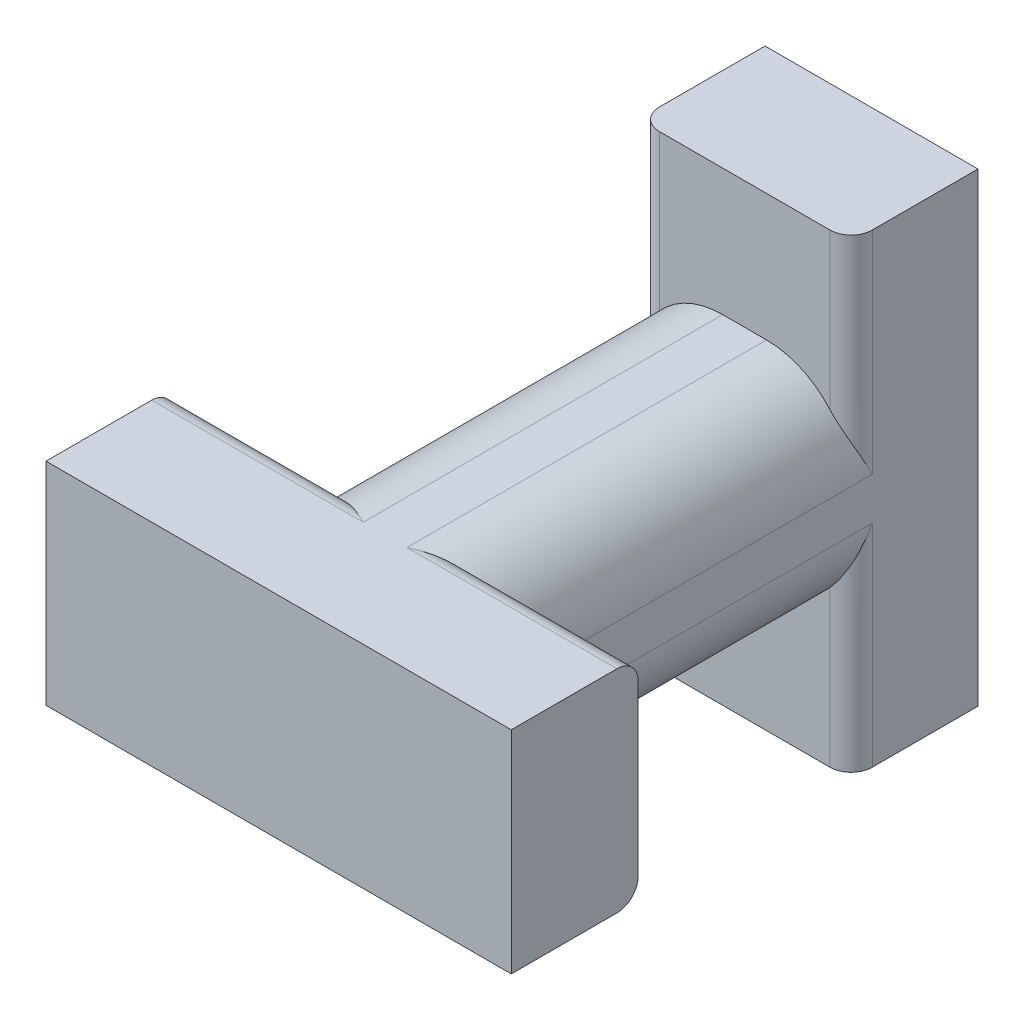
ISO-10303-21;
HEADER;
FILE_DESCRIPTION(('STEP AP214'),'2;1');
FILE_NAME('part.step','',(''),(''),'','','');
FILE_SCHEMA(('AUTOMOTIVE_DESIGN { 1 0 10303 214 1 1 1 1 }'));
ENDSEC;
DATA;
#1=APPLICATION_CONTEXT('core data for automotive mechanical design processes');
#2=APPLICATION_PROTOCOL_DEFINITION('international standard','automotive_design',2000,#1);
#3=PRODUCT_CONTEXT('',#1,'mechanical');
#4=PRODUCT('Part','Part','',(#3));
#5=PRODUCT_RELATED_PRODUCT_CATEGORY('part','',(#4));
#6=PRODUCT_DEFINITION_FORMATION('','',#4);
#7=PRODUCT_DEFINITION_CONTEXT('part definition',#1,'design');
#8=PRODUCT_DEFINITION('design','',#6,#7);
#9=PRODUCT_DEFINITION_SHAPE('','',#8);
#10=(LENGTH_UNIT() NAMED_UNIT(*) SI_UNIT(.MILLI.,.METRE.));
#11=(NAMED_UNIT(*) PLANE_ANGLE_UNIT() SI_UNIT($,.RADIAN.));
#12=(NAMED_UNIT(*) SI_UNIT($,.STERADIAN.) SOLID_ANGLE_UNIT());
#13=UNCERTAINTY_MEASURE_WITH_UNIT(LENGTH_MEASURE(1.E-05),#10,'distance_accuracy_value','');
#14=(GEOMETRIC_REPRESENTATION_CONTEXT(3) GLOBAL_UNCERTAINTY_ASSIGNED_CONTEXT((#13)) GLOBAL_UNIT_ASSIGNED_CONTEXT((#10,
#11,#12)) REPRESENTATION_CONTEXT('',''));
#15=CARTESIAN_POINT('',(0.,0.,0.));
#16=DIRECTION('',(0.,0.,1.));
#17=DIRECTION('',(1.,0.,0.));
#18=AXIS2_PLACEMENT_3D('',#15,#16,#17);
#19=CARTESIAN_POINT('',(36.8133356797978,21.4816414703038,8.));
#20=DIRECTION('',(-1.,0.,0.));
#21=DIRECTION('',(0.,0.,1.));
#22=AXIS2_PLACEMENT_3D('',#19,#20,#21);
#23=PLANE('',#22);
#24=DIRECTION('',(0.,0.,-1.));
#25=VECTOR('',#24,1.);
#26=CARTESIAN_POINT('',(36.8133356797978,18.4816414703039,8.));
#27=LINE('',#26,#25);
#28=CARTESIAN_POINT('',(36.8133356797978,18.4816414703039,8.));
#29=VERTEX_POINT('',#28);
#30=CARTESIAN_POINT('',(36.8133356797978,18.4816414703039,-0.5));
#31=VERTEX_POINT('',#30);
#32=EDGE_CURVE('E277',#29,#31,#27,.T.);
#33=ORIENTED_EDGE('',*,*,#32,.T.);
#34=DIRECTION('',(0.,1.,0.));
#35=VECTOR('',#34,1.);
#36=CARTESIAN_POINT('',(36.8133356797978,13.4816414703038,-0.5));
#37=LINE('',#36,#35);
#38=CARTESIAN_POINT('',(36.8133356797978,13.4816414703038,-0.5));
#39=VERTEX_POINT('',#38);
#40=EDGE_CURVE('E347',#31,#39,#37,.F.);
#41=ORIENTED_EDGE('',*,*,#40,.T.);
#42=DIRECTION('',(0.,0.,-1.));
#43=VECTOR('',#42,1.);
#44=CARTESIAN_POINT('',(36.8133356797978,13.4816414703038,0.));
#45=LINE('',#44,#43);
#46=CARTESIAN_POINT('',(36.8133356797978,13.4816414703038,-3.));
#47=VERTEX_POINT('',#46);
#48=EDGE_CURVE('E253',#39,#47,#45,.T.);
#49=ORIENTED_EDGE('',*,*,#48,.T.);
#50=DIRECTION('',(0.,1.,0.));
#51=VECTOR('',#50,1.);
#52=CARTESIAN_POINT('',(36.8133356797978,13.4816414703038,-3.));
#53=LINE('',#52,#51);
#54=CARTESIAN_POINT('',(36.8133356797978,24.4816414703038,-3.));
#55=VERTEX_POINT('',#54);
#56=EDGE_CURVE('E258',#47,#55,#53,.T.);
#57=ORIENTED_EDGE('',*,*,#56,.T.);
#58=DIRECTION('',(0.,0.,-1.));
#59=VECTOR('',#58,1.);
#60=CARTESIAN_POINT('',(36.8133356797978,24.4816414703038,0.));
#61=LINE('',#60,#59);
#62=CARTESIAN_POINT('',(36.8133356797978,24.4816414703038,-0.5));
#63=VERTEX_POINT('',#62);
#64=EDGE_CURVE('E242',#63,#55,#61,.T.);
#65=ORIENTED_EDGE('',*,*,#64,.F.);
#66=DIRECTION('',(0.,1.,0.));
#67=VECTOR('',#66,1.);
#68=CARTESIAN_POINT('',(36.8133356797978,19.4816414703038,-0.5));
#69=LINE('',#68,#67);
#70=CARTESIAN_POINT('',(36.8133356797978,19.4816414703038,-0.5));
#71=VERTEX_POINT('',#70);
#72=EDGE_CURVE('E344',#63,#71,#69,.F.);
#73=ORIENTED_EDGE('',*,*,#72,.T.);
#74=DIRECTION('',(0.,0.,-1.));
#75=VECTOR('',#74,1.);
#76=CARTESIAN_POINT('',(36.8133356797978,19.4816414703038,8.));
#77=LINE('',#76,#75);
#78=CARTESIAN_POINT('',(36.8133356797978,19.4816414703038,8.));
#79=VERTEX_POINT('',#78);
#80=EDGE_CURVE('E279',#71,#79,#77,.F.);
#81=ORIENTED_EDGE('',*,*,#80,.T.);
#82=DIRECTION('',(0.,1.,0.));
#83=VECTOR('',#82,1.);
#84=CARTESIAN_POINT('',(36.8133356797978,21.4816414703038,8.));
#85=LINE('',#84,#83);
#86=EDGE_CURVE('E269',#29,#79,#85,.T.);
#87=ORIENTED_EDGE('',*,*,#86,.F.);
#88=EDGE_LOOP('',(#33,#41,#49,#57,#65,#73,#81,#87));
#89=FACE_BOUND('',#88,.T.);
#90=ADVANCED_FACE('F32',(#89),#23,.F.);
#91=CARTESIAN_POINT('',(31.7782286418107,21.4816414703038,8.));
#92=DIRECTION('',(0.,-1.,0.));
#93=DIRECTION('',(0.,0.,-1.));
#94=AXIS2_PLACEMENT_3D('',#91,#92,#93);
#95=PLANE('',#94);
#96=DIRECTION('',(0.,0.,-1.));
#97=VECTOR('',#96,1.);
#98=CARTESIAN_POINT('',(33.7782286418107,21.4816414703038,8.));
#99=LINE('',#98,#97);
#100=CARTESIAN_POINT('',(33.7782286418107,21.4816414703038,0.));
#101=VERTEX_POINT('',#100);
#102=CARTESIAN_POINT('',(33.7782286418107,21.4816414703038,8.5));
#103=VERTEX_POINT('',#102);
#104=EDGE_CURVE('E284',#101,#103,#99,.F.);
#105=ORIENTED_EDGE('',*,*,#104,.T.);
#106=DIRECTION('',(-1.,0.,0.));
#107=VECTOR('',#106,1.);
#108=CARTESIAN_POINT('',(28.7782286418107,21.4816414703038,8.5));
#109=LINE('',#108,#107);
#110=CARTESIAN_POINT('',(28.7782286418107,21.4816414703038,8.5));
#111=VERTEX_POINT('',#110);
#112=EDGE_CURVE('E367',#103,#111,#109,.T.);
#113=ORIENTED_EDGE('',*,*,#112,.T.);
#114=DIRECTION('',(0.,0.,-1.));
#115=VECTOR('',#114,1.);
#116=CARTESIAN_POINT('',(28.7782286418107,21.4816414703038,8.));
#117=LINE('',#116,#115);
#118=CARTESIAN_POINT('',(28.7782286418107,21.4816414703038,11.));
#119=VERTEX_POINT('',#118);
#120=EDGE_CURVE('E222',#119,#111,#117,.T.);
#121=ORIENTED_EDGE('',*,*,#120,.F.);
#122=DIRECTION('',(-1.,0.,0.));
#123=VECTOR('',#122,1.);
#124=CARTESIAN_POINT('',(39.7782286418107,21.4816414703038,11.));
#125=LINE('',#124,#123);
#126=CARTESIAN_POINT('',(39.7782286418107,21.4816414703038,11.));
#127=VERTEX_POINT('',#126);
#128=EDGE_CURVE('E218',#127,#119,#125,.T.);
#129=ORIENTED_EDGE('',*,*,#128,.F.);
#130=DIRECTION('',(0.,0.,-1.));
#131=VECTOR('',#130,1.);
#132=CARTESIAN_POINT('',(39.7782286418107,21.4816414703038,8.));
#133=LINE('',#132,#131);
#134=CARTESIAN_POINT('',(39.7782286418107,21.4816414703038,8.5));
#135=VERTEX_POINT('',#134);
#136=EDGE_CURVE('E219',#127,#135,#133,.T.);
#137=ORIENTED_EDGE('',*,*,#136,.T.);
#138=DIRECTION('',(-1.,0.,0.));
#139=VECTOR('',#138,1.);
#140=CARTESIAN_POINT('',(34.8133356797978,21.4816414703038,8.5));
#141=LINE('',#140,#139);
#142=CARTESIAN_POINT('',(34.8133356797978,21.4816414703038,8.5));
#143=VERTEX_POINT('',#142);
#144=EDGE_CURVE('E304',#135,#143,#141,.T.);
#145=ORIENTED_EDGE('',*,*,#144,.T.);
#146=DIRECTION('',(0.,0.,-1.));
#147=VECTOR('',#146,1.);
#148=CARTESIAN_POINT('',(34.8133356797978,21.4816414703038,8.));
#149=LINE('',#148,#147);
#150=CARTESIAN_POINT('',(34.8133356797978,21.4816414703038,0.));
#151=VERTEX_POINT('',#150);
#152=EDGE_CURVE('E275',#143,#151,#149,.T.);
#153=ORIENTED_EDGE('',*,*,#152,.T.);
#154=DIRECTION('',(-1.,0.,0.));
#155=VECTOR('',#154,1.);
#156=CARTESIAN_POINT('',(31.7782286418107,21.4816414703038,0.));
#157=LINE('',#156,#155);
#158=EDGE_CURVE('E261',#151,#101,#157,.T.);
#159=ORIENTED_EDGE('',*,*,#158,.T.);
#160=EDGE_LOOP('',(#105,#113,#121,#129,#137,#145,#153,#159));
#161=FACE_BOUND('',#160,.T.);
#162=ADVANCED_FACE('F302',(#161),#95,.F.);
#163=CARTESIAN_POINT('',(31.7782286418107,21.4816414703038,8.));
#164=DIRECTION('',(1.,0.,0.));
#165=DIRECTION('',(0.,0.,-1.));
#166=AXIS2_PLACEMENT_3D('',#163,#164,#165);
#167=PLANE('',#166);
#168=DIRECTION('',(0.,0.,1.));
#169=VECTOR('',#168,1.);
#170=CARTESIAN_POINT('',(31.7782286418107,13.4816414703038,0.));
#171=LINE('',#170,#169);
#172=CARTESIAN_POINT('',(31.7782286418107,13.4816414703038,-3.));
#173=VERTEX_POINT('',#172);
#174=CARTESIAN_POINT('',(31.7782286418107,13.4816414703038,-0.5));
#175=VERTEX_POINT('',#174);
#176=EDGE_CURVE('E247',#173,#175,#171,.T.);
#177=ORIENTED_EDGE('',*,*,#176,.T.);
#178=DIRECTION('',(0.,1.,0.));
#179=VECTOR('',#178,1.);
#180=CARTESIAN_POINT('',(31.7782286418107,18.4816414703039,-0.5));
#181=LINE('',#180,#179);
#182=CARTESIAN_POINT('',(31.7782286418107,18.4816414703039,-0.5));
#183=VERTEX_POINT('',#182);
#184=EDGE_CURVE('E356',#175,#183,#181,.T.);
#185=ORIENTED_EDGE('',*,*,#184,.T.);
#186=DIRECTION('',(0.,0.,-1.));
#187=VECTOR('',#186,1.);
#188=CARTESIAN_POINT('',(31.7782286418107,18.4816414703039,8.));
#189=LINE('',#188,#187);
#190=CARTESIAN_POINT('',(31.7782286418107,18.4816414703039,8.));
#191=VERTEX_POINT('',#190);
#192=EDGE_CURVE('E281',#183,#191,#189,.F.);
#193=ORIENTED_EDGE('',*,*,#192,.T.);
#194=DIRECTION('',(0.,-1.,0.));
#195=VECTOR('',#194,1.);
#196=CARTESIAN_POINT('',(31.7782286418107,21.4816414703038,8.));
#197=LINE('',#196,#195);
#198=CARTESIAN_POINT('',(31.7782286418107,19.4816414703038,8.));
#199=VERTEX_POINT('',#198);
#200=EDGE_CURVE('E273',#199,#191,#197,.T.);
#201=ORIENTED_EDGE('',*,*,#200,.F.);
#202=DIRECTION('',(0.,0.,-1.));
#203=VECTOR('',#202,1.);
#204=CARTESIAN_POINT('',(31.7782286418107,19.4816414703038,8.));
#205=LINE('',#204,#203);
#206=CARTESIAN_POINT('',(31.7782286418107,19.4816414703038,-0.5));
#207=VERTEX_POINT('',#206);
#208=EDGE_CURVE('E286',#199,#207,#205,.T.);
#209=ORIENTED_EDGE('',*,*,#208,.T.);
#210=DIRECTION('',(0.,1.,0.));
#211=VECTOR('',#210,1.);
#212=CARTESIAN_POINT('',(31.7782286418107,24.4816414703038,-0.5));
#213=LINE('',#212,#211);
#214=CARTESIAN_POINT('',(31.7782286418107,24.4816414703038,-0.5));
#215=VERTEX_POINT('',#214);
#216=EDGE_CURVE('E353',#207,#215,#213,.T.);
#217=ORIENTED_EDGE('',*,*,#216,.T.);
#218=DIRECTION('',(0.,0.,1.));
#219=VECTOR('',#218,1.);
#220=CARTESIAN_POINT('',(31.7782286418107,24.4816414703038,0.));
#221=LINE('',#220,#219);
#222=CARTESIAN_POINT('',(31.7782286418107,24.4816414703038,-3.));
#223=VERTEX_POINT('',#222);
#224=EDGE_CURVE('E235',#223,#215,#221,.T.);
#225=ORIENTED_EDGE('',*,*,#224,.F.);
#226=DIRECTION('',(0.,1.,0.));
#227=VECTOR('',#226,1.);
#228=CARTESIAN_POINT('',(31.7782286418107,13.4816414703038,-3.));
#229=LINE('',#228,#227);
#230=EDGE_CURVE('E259',#173,#223,#229,.T.);
#231=ORIENTED_EDGE('',*,*,#230,.F.);
#232=EDGE_LOOP('',(#177,#185,#193,#201,#209,#217,#225,#231));
#233=FACE_BOUND('',#232,.T.);
#234=ADVANCED_FACE('F480',(#233),#167,.F.);
#235=CARTESIAN_POINT('',(31.7782286418107,16.4816414703039,8.));
#236=DIRECTION('',(0.,1.,0.));
#237=DIRECTION('',(0.,0.,1.));
#238=AXIS2_PLACEMENT_3D('',#235,#236,#237);
#239=PLANE('',#238);
#240=DIRECTION('',(0.,0.,-1.));
#241=VECTOR('',#240,1.);
#242=CARTESIAN_POINT('',(34.8133356797978,16.4816414703039,8.));
#243=LINE('',#242,#241);
#244=CARTESIAN_POINT('',(34.8133356797978,16.4816414703039,0.));
#245=VERTEX_POINT('',#244);
#246=CARTESIAN_POINT('',(34.8133356797978,16.4816414703039,8.5));
#247=VERTEX_POINT('',#246);
#248=EDGE_CURVE('E52',#245,#247,#243,.F.);
#249=ORIENTED_EDGE('',*,*,#248,.T.);
#250=DIRECTION('',(-1.,0.,0.));
#251=VECTOR('',#250,1.);
#252=CARTESIAN_POINT('',(39.7782286418107,16.4816414703039,8.5));
#253=LINE('',#252,#251);
#254=CARTESIAN_POINT('',(39.7782286418107,16.4816414703039,8.5));
#255=VERTEX_POINT('',#254);
#256=EDGE_CURVE('E388',#247,#255,#253,.F.);
#257=ORIENTED_EDGE('',*,*,#256,.T.);
#258=DIRECTION('',(0.,0.,1.));
#259=VECTOR('',#258,1.);
#260=CARTESIAN_POINT('',(39.7782286418107,16.4816414703039,8.));
#261=LINE('',#260,#259);
#262=CARTESIAN_POINT('',(39.7782286418107,16.4816414703039,11.));
#263=VERTEX_POINT('',#262);
#264=EDGE_CURVE('E214',#255,#263,#261,.T.);
#265=ORIENTED_EDGE('',*,*,#264,.T.);
#266=DIRECTION('',(-1.,0.,0.));
#267=VECTOR('',#266,1.);
#268=CARTESIAN_POINT('',(39.7782286418107,16.4816414703039,11.));
#269=LINE('',#268,#267);
#270=CARTESIAN_POINT('',(28.7782286418107,16.4816414703039,11.));
#271=VERTEX_POINT('',#270);
#272=EDGE_CURVE('E211',#263,#271,#269,.T.);
#273=ORIENTED_EDGE('',*,*,#272,.T.);
#274=DIRECTION('',(0.,0.,1.));
#275=VECTOR('',#274,1.);
#276=CARTESIAN_POINT('',(28.7782286418107,16.4816414703039,8.));
#277=LINE('',#276,#275);
#278=CARTESIAN_POINT('',(28.7782286418107,16.4816414703039,8.5));
#279=VERTEX_POINT('',#278);
#280=EDGE_CURVE('E198',#279,#271,#277,.T.);
#281=ORIENTED_EDGE('',*,*,#280,.F.);
#282=DIRECTION('',(-1.,0.,0.));
#283=VECTOR('',#282,1.);
#284=CARTESIAN_POINT('',(33.7782286418107,16.4816414703039,8.5));
#285=LINE('',#284,#283);
#286=CARTESIAN_POINT('',(33.7782286418107,16.4816414703039,8.5));
#287=VERTEX_POINT('',#286);
#288=EDGE_CURVE('E386',#279,#287,#285,.F.);
#289=ORIENTED_EDGE('',*,*,#288,.T.);
#290=DIRECTION('',(0.,0.,-1.));
#291=VECTOR('',#290,1.);
#292=CARTESIAN_POINT('',(33.7782286418107,16.4816414703039,8.));
#293=LINE('',#292,#291);
#294=CARTESIAN_POINT('',(33.7782286418107,16.4816414703039,0.));
#295=VERTEX_POINT('',#294);
#296=EDGE_CURVE('E59',#287,#295,#293,.T.);
#297=ORIENTED_EDGE('',*,*,#296,.T.);
#298=DIRECTION('',(1.,0.,0.));
#299=VECTOR('',#298,1.);
#300=CARTESIAN_POINT('',(31.7782286418107,16.4816414703039,0.));
#301=LINE('',#300,#299);
#302=EDGE_CURVE('E274',#295,#245,#301,.T.);
#303=ORIENTED_EDGE('',*,*,#302,.T.);
#304=EDGE_LOOP('',(#249,#257,#265,#273,#281,#289,#297,#303));
#305=FACE_BOUND('',#304,.T.);
#306=ADVANCED_FACE('F212',(#305),#239,.F.);
#307=CARTESIAN_POINT('',(31.7782286418107,13.4816414703038,0.));
#308=DIRECTION('',(0.,0.,1.));
#309=DIRECTION('',(1.,0.,0.));
#310=AXIS2_PLACEMENT_3D('',#307,#308,#309);
#311=PLANE('',#310);
#312=DIRECTION('',(1.,0.,0.));
#313=VECTOR('',#312,1.);
#314=CARTESIAN_POINT('',(31.7782286418107,13.4816414703038,0.));
#315=LINE('',#314,#313);
#316=CARTESIAN_POINT('',(32.2782286418107,13.4816414703038,0.));
#317=VERTEX_POINT('',#316);
#318=CARTESIAN_POINT('',(36.3133356797978,13.4816414703038,0.));
#319=VERTEX_POINT('',#318);
#320=EDGE_CURVE('E250',#317,#319,#315,.T.);
#321=ORIENTED_EDGE('',*,*,#320,.T.);
#322=DIRECTION('',(0.,1.,0.));
#323=VECTOR('',#322,1.);
#324=CARTESIAN_POINT('',(36.3133356797978,18.4816414703039,0.));
#325=LINE('',#324,#323);
#326=CARTESIAN_POINT('',(36.3133356797978,17.1587658147716,0.));
#327=VERTEX_POINT('',#326);
#328=EDGE_CURVE('E341',#319,#327,#325,.T.);
#329=ORIENTED_EDGE('',*,*,#328,.T.);
#330=CARTESIAN_POINT('',(34.8133356797978,18.4816414703039,0.));
#331=DIRECTION('',(0.,0.,1.));
#332=DIRECTION('',(1.,0.,0.));
#333=AXIS2_PLACEMENT_3D('',#330,#331,#332);
#334=CIRCLE('',#333,2.);
#335=EDGE_CURVE('E335',#327,#245,#334,.F.);
#336=ORIENTED_EDGE('',*,*,#335,.T.);
#337=ORIENTED_EDGE('',*,*,#302,.F.);
#338=CARTESIAN_POINT('',(33.7782286418107,18.4816414703039,0.));
#339=DIRECTION('',(0.,0.,1.));
#340=DIRECTION('',(1.,0.,0.));
#341=AXIS2_PLACEMENT_3D('',#338,#339,#340);
#342=CIRCLE('',#341,2.);
#343=CARTESIAN_POINT('',(32.2782286418107,17.1587658147716,0.));
#344=VERTEX_POINT('',#343);
#345=EDGE_CURVE('E324',#295,#344,#342,.F.);
#346=ORIENTED_EDGE('',*,*,#345,.T.);
#347=DIRECTION('',(0.,1.,0.));
#348=VECTOR('',#347,1.);
#349=CARTESIAN_POINT('',(32.2782286418107,13.4816414703038,0.));
#350=LINE('',#349,#348);
#351=EDGE_CURVE('E339',#344,#317,#350,.F.);
#352=ORIENTED_EDGE('',*,*,#351,.T.);
#353=EDGE_LOOP('',(#321,#329,#336,#337,#346,#352));
#354=FACE_BOUND('',#353,.T.);
#355=ADVANCED_FACE('F488',(#354),#311,.T.);
#356=DIRECTION('',(1.,0.,0.));
#357=VECTOR('',#356,1.);
#358=CARTESIAN_POINT('',(31.7782286418107,24.4816414703038,0.));
#359=LINE('',#358,#357);
#360=CARTESIAN_POINT('',(32.2782286418107,24.4816414703038,0.));
#361=VERTEX_POINT('',#360);
#362=CARTESIAN_POINT('',(36.3133356797978,24.4816414703038,0.));
#363=VERTEX_POINT('',#362);
#364=EDGE_CURVE('E239',#361,#363,#359,.T.);
#365=ORIENTED_EDGE('',*,*,#364,.F.);
#366=DIRECTION('',(0.,1.,0.));
#367=VECTOR('',#366,1.);
#368=CARTESIAN_POINT('',(32.2782286418107,19.4816414703038,0.));
#369=LINE('',#368,#367);
#370=CARTESIAN_POINT('',(32.2782286418107,20.8045171258361,0.));
#371=VERTEX_POINT('',#370);
#372=EDGE_CURVE('E317',#361,#371,#369,.F.);
#373=ORIENTED_EDGE('',*,*,#372,.T.);
#374=CARTESIAN_POINT('',(33.7782286418107,19.4816414703038,0.));
#375=DIRECTION('',(0.,0.,1.));
#376=DIRECTION('',(1.,0.,0.));
#377=AXIS2_PLACEMENT_3D('',#374,#375,#376);
#378=CIRCLE('',#377,2.);
#379=EDGE_CURVE('E315',#371,#101,#378,.F.);
#380=ORIENTED_EDGE('',*,*,#379,.T.);
#381=ORIENTED_EDGE('',*,*,#158,.F.);
#382=CARTESIAN_POINT('',(34.8133356797978,19.4816414703038,0.));
#383=DIRECTION('',(0.,0.,1.));
#384=DIRECTION('',(1.,0.,0.));
#385=AXIS2_PLACEMENT_3D('',#382,#383,#384);
#386=CIRCLE('',#385,2.);
#387=CARTESIAN_POINT('',(36.3133356797978,20.8045171258361,0.));
#388=VERTEX_POINT('',#387);
#389=EDGE_CURVE('E312',#151,#388,#386,.F.);
#390=ORIENTED_EDGE('',*,*,#389,.T.);
#391=DIRECTION('',(0.,1.,0.));
#392=VECTOR('',#391,1.);
#393=CARTESIAN_POINT('',(36.3133356797978,24.4816414703038,0.));
#394=LINE('',#393,#392);
#395=EDGE_CURVE('E363',#388,#363,#394,.T.);
#396=ORIENTED_EDGE('',*,*,#395,.T.);
#397=EDGE_LOOP('',(#365,#373,#380,#381,#390,#396));
#398=FACE_BOUND('',#397,.T.);
#399=ADVANCED_FACE('F310',(#398),#311,.T.);
#400=CARTESIAN_POINT('',(31.7782286418107,13.4816414703038,-3.));
#401=DIRECTION('',(0.,0.,-1.));
#402=DIRECTION('',(-1.,0.,0.));
#403=AXIS2_PLACEMENT_3D('',#400,#401,#402);
#404=PLANE('',#403);
#405=ORIENTED_EDGE('',*,*,#230,.T.);
#406=DIRECTION('',(-1.,0.,0.));
#407=VECTOR('',#406,1.);
#408=CARTESIAN_POINT('',(31.7782286418107,24.4816414703038,-3.));
#409=LINE('',#408,#407);
#410=EDGE_CURVE('E244',#55,#223,#409,.T.);
#411=ORIENTED_EDGE('',*,*,#410,.F.);
#412=ORIENTED_EDGE('',*,*,#56,.F.);
#413=DIRECTION('',(-1.,0.,0.));
#414=VECTOR('',#413,1.);
#415=CARTESIAN_POINT('',(31.7782286418107,13.4816414703038,-3.));
#416=LINE('',#415,#414);
#417=EDGE_CURVE('E255',#47,#173,#416,.T.);
#418=ORIENTED_EDGE('',*,*,#417,.T.);
#419=EDGE_LOOP('',(#405,#411,#412,#418));
#420=FACE_BOUND('',#419,.T.);
#421=ADVANCED_FACE('F492',(#420),#404,.T.);
#422=CARTESIAN_POINT('',(0.,13.4816414703038,0.));
#423=DIRECTION('',(0.,-1.,0.));
#424=DIRECTION('',(0.,0.,-1.));
#425=AXIS2_PLACEMENT_3D('',#422,#423,#424);
#426=PLANE('',#425);
#427=ORIENTED_EDGE('',*,*,#48,.F.);
#428=CARTESIAN_POINT('',(36.3133356797978,13.4816414703038,-0.5));
#429=DIRECTION('',(0.,-1.,0.));
#430=DIRECTION('',(0.,0.,-1.));
#431=AXIS2_PLACEMENT_3D('',#428,#429,#430);
#432=CIRCLE('',#431,0.5);
#433=EDGE_CURVE('E351',#39,#319,#432,.T.);
#434=ORIENTED_EDGE('',*,*,#433,.T.);
#435=ORIENTED_EDGE('',*,*,#320,.F.);
#436=CARTESIAN_POINT('',(32.2782286418107,13.4816414703038,-0.5));
#437=DIRECTION('',(0.,-1.,0.));
#438=DIRECTION('',(0.,0.,-1.));
#439=AXIS2_PLACEMENT_3D('',#436,#437,#438);
#440=CIRCLE('',#439,0.5);
#441=EDGE_CURVE('E349',#317,#175,#440,.T.);
#442=ORIENTED_EDGE('',*,*,#441,.T.);
#443=ORIENTED_EDGE('',*,*,#176,.F.);
#444=ORIENTED_EDGE('',*,*,#417,.F.);
#445=EDGE_LOOP('',(#427,#434,#435,#442,#443,#444));
#446=FACE_BOUND('',#445,.T.);
#447=ADVANCED_FACE('F495',(#446),#426,.T.);
#448=CARTESIAN_POINT('',(0.,24.4816414703038,0.));
#449=DIRECTION('',(0.,-1.,0.));
#450=DIRECTION('',(0.,0.,-1.));
#451=AXIS2_PLACEMENT_3D('',#448,#449,#450);
#452=PLANE('',#451);
#453=ORIENTED_EDGE('',*,*,#224,.T.);
#454=CARTESIAN_POINT('',(32.2782286418107,24.4816414703038,-0.5));
#455=DIRECTION('',(0.,-1.,0.));
#456=DIRECTION('',(0.,0.,-1.));
#457=AXIS2_PLACEMENT_3D('',#454,#455,#456);
#458=CIRCLE('',#457,0.5);
#459=EDGE_CURVE('E361',#215,#361,#458,.F.);
#460=ORIENTED_EDGE('',*,*,#459,.T.);
#461=ORIENTED_EDGE('',*,*,#364,.T.);
#462=CARTESIAN_POINT('',(36.3133356797978,24.4816414703038,-0.5));
#463=DIRECTION('',(0.,-1.,0.));
#464=DIRECTION('',(0.,0.,-1.));
#465=AXIS2_PLACEMENT_3D('',#462,#463,#464);
#466=CIRCLE('',#465,0.5);
#467=EDGE_CURVE('E359',#363,#63,#466,.F.);
#468=ORIENTED_EDGE('',*,*,#467,.T.);
#469=ORIENTED_EDGE('',*,*,#64,.T.);
#470=ORIENTED_EDGE('',*,*,#410,.T.);
#471=EDGE_LOOP('',(#453,#460,#461,#468,#469,#470));
#472=FACE_BOUND('',#471,.T.);
#473=ADVANCED_FACE('F499',(#472),#452,.F.);
#474=CARTESIAN_POINT('',(39.7782286418107,21.4816414703038,8.));
#475=DIRECTION('',(0.,0.,-1.));
#476=DIRECTION('',(-1.,0.,0.));
#477=AXIS2_PLACEMENT_3D('',#474,#475,#476);
#478=PLANE('',#477);
#479=CARTESIAN_POINT('',(34.8133356797978,19.4816414703038,8.));
#480=DIRECTION('',(0.,0.,-1.));
#481=DIRECTION('',(-1.,0.,0.));
#482=AXIS2_PLACEMENT_3D('',#479,#480,#481);
#483=CIRCLE('',#482,2.);
#484=CARTESIAN_POINT('',(36.1362113353301,20.9816414703038,8.));
#485=VERTEX_POINT('',#484);
#486=EDGE_CURVE('E322',#79,#485,#483,.F.);
#487=ORIENTED_EDGE('',*,*,#486,.T.);
#488=DIRECTION('',(-1.,0.,0.));
#489=VECTOR('',#488,1.);
#490=CARTESIAN_POINT('',(39.7782286418107,20.9816414703038,8.));
#491=LINE('',#490,#489);
#492=CARTESIAN_POINT('',(39.7782286418107,20.9816414703038,8.));
#493=VERTEX_POINT('',#492);
#494=EDGE_CURVE('E380',#485,#493,#491,.F.);
#495=ORIENTED_EDGE('',*,*,#494,.T.);
#496=DIRECTION('',(0.,-1.,0.));
#497=VECTOR('',#496,1.);
#498=CARTESIAN_POINT('',(39.7782286418107,21.4816414703038,8.));
#499=LINE('',#498,#497);
#500=CARTESIAN_POINT('',(39.7782286418107,16.9816414703039,8.));
#501=VERTEX_POINT('',#500);
#502=EDGE_CURVE('E224',#493,#501,#499,.T.);
#503=ORIENTED_EDGE('',*,*,#502,.T.);
#504=DIRECTION('',(-1.,0.,0.));
#505=VECTOR('',#504,1.);
#506=CARTESIAN_POINT('',(34.8133356797978,16.9816414703039,8.));
#507=LINE('',#506,#505);
#508=CARTESIAN_POINT('',(36.1362113353301,16.9816414703039,8.));
#509=VERTEX_POINT('',#508);
#510=EDGE_CURVE('E377',#501,#509,#507,.T.);
#511=ORIENTED_EDGE('',*,*,#510,.T.);
#512=CARTESIAN_POINT('',(34.8133356797978,18.4816414703039,8.));
#513=DIRECTION('',(0.,0.,-1.));
#514=DIRECTION('',(-1.,0.,0.));
#515=AXIS2_PLACEMENT_3D('',#512,#513,#514);
#516=CIRCLE('',#515,2.);
#517=EDGE_CURVE('E337',#509,#29,#516,.F.);
#518=ORIENTED_EDGE('',*,*,#517,.T.);
#519=ORIENTED_EDGE('',*,*,#86,.T.);
#520=EDGE_LOOP('',(#487,#495,#503,#511,#518,#519));
#521=FACE_BOUND('',#520,.T.);
#522=ADVANCED_FACE('F503',(#521),#478,.T.);
#523=DIRECTION('',(0.,-1.,0.));
#524=VECTOR('',#523,1.);
#525=CARTESIAN_POINT('',(28.7782286418107,21.4816414703038,8.));
#526=LINE('',#525,#524);
#527=CARTESIAN_POINT('',(28.7782286418107,20.9816414703038,8.));
#528=VERTEX_POINT('',#527);
#529=CARTESIAN_POINT('',(28.7782286418107,16.9816414703039,8.));
#530=VERTEX_POINT('',#529);
#531=EDGE_CURVE('E208',#528,#530,#526,.T.);
#532=ORIENTED_EDGE('',*,*,#531,.F.);
#533=DIRECTION('',(-1.,0.,0.));
#534=VECTOR('',#533,1.);
#535=CARTESIAN_POINT('',(33.7782286418107,20.9816414703038,8.));
#536=LINE('',#535,#534);
#537=CARTESIAN_POINT('',(32.4553529862784,20.9816414703038,8.));
#538=VERTEX_POINT('',#537);
#539=EDGE_CURVE('E375',#528,#538,#536,.F.);
#540=ORIENTED_EDGE('',*,*,#539,.T.);
#541=CARTESIAN_POINT('',(33.7782286418107,19.4816414703038,8.));
#542=DIRECTION('',(0.,0.,-1.));
#543=DIRECTION('',(-1.,0.,0.));
#544=AXIS2_PLACEMENT_3D('',#541,#542,#543);
#545=CIRCLE('',#544,2.);
#546=EDGE_CURVE('E321',#538,#199,#545,.F.);
#547=ORIENTED_EDGE('',*,*,#546,.T.);
#548=ORIENTED_EDGE('',*,*,#200,.T.);
#549=CARTESIAN_POINT('',(33.7782286418107,18.4816414703039,8.));
#550=DIRECTION('',(0.,0.,-1.));
#551=DIRECTION('',(-1.,0.,0.));
#552=AXIS2_PLACEMENT_3D('',#549,#550,#551);
#553=CIRCLE('',#552,2.);
#554=CARTESIAN_POINT('',(32.4553529862784,16.9816414703039,8.));
#555=VERTEX_POINT('',#554);
#556=EDGE_CURVE('E332',#191,#555,#553,.F.);
#557=ORIENTED_EDGE('',*,*,#556,.T.);
#558=DIRECTION('',(-1.,0.,0.));
#559=VECTOR('',#558,1.);
#560=CARTESIAN_POINT('',(28.7782286418107,16.9816414703039,8.));
#561=LINE('',#560,#559);
#562=EDGE_CURVE('E372',#555,#530,#561,.T.);
#563=ORIENTED_EDGE('',*,*,#562,.T.);
#564=EDGE_LOOP('',(#532,#540,#547,#548,#557,#563));
#565=FACE_BOUND('',#564,.T.);
#566=ADVANCED_FACE('F505',(#565),#478,.T.);
#567=CARTESIAN_POINT('',(39.7782286418107,21.4816414703038,11.));
#568=DIRECTION('',(0.,0.,1.));
#569=DIRECTION('',(1.,0.,0.));
#570=AXIS2_PLACEMENT_3D('',#567,#568,#569);
#571=PLANE('',#570);
#572=ORIENTED_EDGE('',*,*,#128,.T.);
#573=DIRECTION('',(0.,1.,0.));
#574=VECTOR('',#573,1.);
#575=CARTESIAN_POINT('',(28.7782286418107,21.4816414703038,11.));
#576=LINE('',#575,#574);
#577=EDGE_CURVE('E203',#271,#119,#576,.T.);
#578=ORIENTED_EDGE('',*,*,#577,.F.);
#579=ORIENTED_EDGE('',*,*,#272,.F.);
#580=DIRECTION('',(0.,1.,0.));
#581=VECTOR('',#580,1.);
#582=CARTESIAN_POINT('',(39.7782286418107,21.4816414703038,11.));
#583=LINE('',#582,#581);
#584=EDGE_CURVE('E231',#263,#127,#583,.T.);
#585=ORIENTED_EDGE('',*,*,#584,.T.);
#586=EDGE_LOOP('',(#572,#578,#579,#585));
#587=FACE_BOUND('',#586,.T.);
#588=ADVANCED_FACE('F221',(#587),#571,.T.);
#589=CARTESIAN_POINT('',(39.7782286418107,0.,0.));
#590=DIRECTION('',(-1.,0.,0.));
#591=DIRECTION('',(0.,0.,1.));
#592=AXIS2_PLACEMENT_3D('',#589,#590,#591);
#593=PLANE('',#592);
#594=ORIENTED_EDGE('',*,*,#502,.F.);
#595=CARTESIAN_POINT('',(39.7782286418107,20.9816414703038,8.5));
#596=DIRECTION('',(-1.,0.,0.));
#597=DIRECTION('',(0.,0.,1.));
#598=AXIS2_PLACEMENT_3D('',#595,#596,#597);
#599=CIRCLE('',#598,0.5);
#600=EDGE_CURVE('E384',#493,#135,#599,.F.);
#601=ORIENTED_EDGE('',*,*,#600,.T.);
#602=ORIENTED_EDGE('',*,*,#136,.F.);
#603=ORIENTED_EDGE('',*,*,#584,.F.);
#604=ORIENTED_EDGE('',*,*,#264,.F.);
#605=CARTESIAN_POINT('',(39.7782286418107,16.9816414703039,8.5));
#606=DIRECTION('',(-1.,0.,0.));
#607=DIRECTION('',(0.,0.,1.));
#608=AXIS2_PLACEMENT_3D('',#605,#606,#607);
#609=CIRCLE('',#608,0.5);
#610=EDGE_CURVE('E382',#255,#501,#609,.F.);
#611=ORIENTED_EDGE('',*,*,#610,.T.);
#612=EDGE_LOOP('',(#594,#601,#602,#603,#604,#611));
#613=FACE_BOUND('',#612,.T.);
#614=ADVANCED_FACE('F511',(#613),#593,.F.);
#615=CARTESIAN_POINT('',(28.7782286418107,0.,0.));
#616=DIRECTION('',(-1.,0.,0.));
#617=DIRECTION('',(0.,0.,1.));
#618=AXIS2_PLACEMENT_3D('',#615,#616,#617);
#619=PLANE('',#618);
#620=ORIENTED_EDGE('',*,*,#120,.T.);
#621=CARTESIAN_POINT('',(28.7782286418107,20.9816414703038,8.5));
#622=DIRECTION('',(-1.,0.,0.));
#623=DIRECTION('',(0.,0.,1.));
#624=AXIS2_PLACEMENT_3D('',#621,#622,#623);
#625=CIRCLE('',#624,0.5);
#626=EDGE_CURVE('E370',#111,#528,#625,.T.);
#627=ORIENTED_EDGE('',*,*,#626,.T.);
#628=ORIENTED_EDGE('',*,*,#531,.T.);
#629=CARTESIAN_POINT('',(28.7782286418107,16.9816414703039,8.5));
#630=DIRECTION('',(-1.,0.,0.));
#631=DIRECTION('',(0.,0.,1.));
#632=AXIS2_PLACEMENT_3D('',#629,#630,#631);
#633=CIRCLE('',#632,0.5);
#634=EDGE_CURVE('E206',#530,#279,#633,.T.);
#635=ORIENTED_EDGE('',*,*,#634,.T.);
#636=ORIENTED_EDGE('',*,*,#280,.T.);
#637=ORIENTED_EDGE('',*,*,#577,.T.);
#638=EDGE_LOOP('',(#620,#627,#628,#635,#636,#637));
#639=FACE_BOUND('',#638,.T.);
#640=ADVANCED_FACE('F201',(#639),#619,.T.);
#641=CARTESIAN_POINT('',(34.8133356797978,19.4816414703038,8.));
#642=DIRECTION('',(0.,0.,-1.));
#643=DIRECTION('',(-1.,0.,0.));
#644=AXIS2_PLACEMENT_3D('',#641,#642,#643);
#645=CYLINDRICAL_SURFACE('',#644,2.);
#646=ORIENTED_EDGE('',*,*,#486,.F.);
#647=ORIENTED_EDGE('',*,*,#80,.F.);
#648=CARTESIAN_POINT('',(36.3133356797978,20.8045171258361,0.));
#649=CARTESIAN_POINT('',(36.3348792323688,20.7800942244967,-1.04114674759746E-05));
#650=CARTESIAN_POINT('',(36.3557930939805,20.7551720866716,-0.00139028328963519));
#651=CARTESIAN_POINT('',(36.3962376700619,20.7045340169578,-0.0064983243941144));
#652=CARTESIAN_POINT('',(36.4157709600959,20.6788196989915,-0.0102219852438329));
#653=CARTESIAN_POINT('',(36.4719206763685,20.6010864302685,-0.0242553324765103));
#654=CARTESIAN_POINT('',(36.5064490533864,20.5480642775938,-0.0374407435075393));
#655=CARTESIAN_POINT('',(36.5626970069065,20.4522641673133,-0.0657438970417556));
#656=CARTESIAN_POINT('',(36.5855607292645,20.4098129648002,-0.0797899779144099));
#657=CARTESIAN_POINT('',(36.6278626433669,20.3241223968362,-0.110443342705814));
#658=CARTESIAN_POINT('',(36.6472994190101,20.2808827136708,-0.127051680123395));
#659=CARTESIAN_POINT('',(36.700755476964,20.1499004442014,-0.179949999388112));
#660=CARTESIAN_POINT('',(36.7297138934638,20.0612523391591,-0.219197759604896));
#661=CARTESIAN_POINT('',(36.7724918450921,19.8921430773087,-0.297621398152313));
#662=CARTESIAN_POINT('',(36.7875722050758,19.811788841019,-0.336380607428422));
#663=CARTESIAN_POINT('',(36.8078116021506,19.6508152428861,-0.415433537416516));
#664=CARTESIAN_POINT('',(36.8129975770811,19.5701972012065,-0.455722786251157));
#665=CARTESIAN_POINT('',(36.8133303426813,19.4869747380622,-0.497333369304363));
#666=CARTESIAN_POINT('',(36.8133356753711,19.4843080645306,-0.498666706269453));
#667=CARTESIAN_POINT('',(36.8133356797978,19.4816414703038,-0.5));
#668=B_SPLINE_CURVE_WITH_KNOTS('',3,(#648,#649,#650,#651,#652,#653,#654,#655,#656,#657,#658,
#659,#660,#661,#662,#663,#664,#665,#666,#667),.UNSPECIFIED.,.F.,.F.,(4,2,2,2,2,2,2,2,2,4),(0.,
0.0975966634312108,0.19500616458061,0.388196470326688,0.538676093841753,0.689217754352665,
0.991572844675021,1.26249642313569,1.53268134341627,1.54162562963826),.UNSPECIFIED.);
#669=EDGE_CURVE('E447',#71,#388,#668,.F.);
#670=ORIENTED_EDGE('',*,*,#669,.T.);
#671=ORIENTED_EDGE('',*,*,#389,.F.);
#672=ORIENTED_EDGE('',*,*,#152,.F.);
#673=CARTESIAN_POINT('',(36.1362113353301,20.9816414703038,8.));
#674=CARTESIAN_POINT('',(36.1117884339907,21.0031850228748,8.00001041146748));
#675=CARTESIAN_POINT('',(36.0868662961656,21.0240988844866,8.00139028328963));
#676=CARTESIAN_POINT('',(36.0362282264518,21.0645434605679,8.00649832439411));
#677=CARTESIAN_POINT('',(36.0105139084856,21.0840767506019,8.01022198524382));
#678=CARTESIAN_POINT('',(35.9327806397625,21.1402264668745,8.02425533247649));
#679=CARTESIAN_POINT('',(35.8797584870878,21.1747548438924,8.03744074350753));
#680=CARTESIAN_POINT('',(35.7839583768072,21.2310027974126,8.06574389704176));
#681=CARTESIAN_POINT('',(35.7415071742941,21.2538665197706,8.07978997791442));
#682=CARTESIAN_POINT('',(35.65581660633,21.296168433873,8.11044334270583));
#683=CARTESIAN_POINT('',(35.6125769231647,21.3156052095161,8.1270516801234));
#684=CARTESIAN_POINT('',(35.4815946536953,21.36906126747,8.17994999938819));
#685=CARTESIAN_POINT('',(35.3929465486532,21.3980196839698,8.21919775960519));
#686=CARTESIAN_POINT('',(35.2238372868026,21.4407976355981,8.29762139815206));
#687=CARTESIAN_POINT('',(35.1434830505125,21.4558779955818,8.33638060742751));
#688=CARTESIAN_POINT('',(34.9825094523805,21.4761173926567,8.41543353741743));
#689=CARTESIAN_POINT('',(34.9018914107021,21.4813033675872,8.45572278625456));
#690=CARTESIAN_POINT('',(34.8186689475563,21.4816361331873,8.49733336930459));
#691=CARTESIAN_POINT('',(34.8160022740246,21.4816414658771,8.49866670626957));
#692=CARTESIAN_POINT('',(34.8133356797978,21.4816414703038,8.5));
#693=B_SPLINE_CURVE_WITH_KNOTS('',3,(#673,#674,#675,#676,#677,#678,#679,#680,#681,#682,#683,
#684,#685,#686,#687,#688,#689,#690,#691,#692),.UNSPECIFIED.,.F.,.F.,(4,2,2,2,2,2,2,2,2,4),(0.,
0.097596663431144,0.19500616458048,0.388196470326684,0.538676093841803,0.689217754352752,
0.99157284467501,1.26249642313568,1.53268134341627,1.54162562963826),.UNSPECIFIED.);
#694=EDGE_CURVE('E418',#143,#485,#693,.F.);
#695=ORIENTED_EDGE('',*,*,#694,.T.);
#696=EDGE_LOOP('',(#646,#647,#670,#671,#672,#695));
#697=FACE_BOUND('',#696,.T.);
#698=ADVANCED_FACE('F454',(#697),#645,.T.);
#699=CARTESIAN_POINT('',(33.7782286418107,19.4816414703038,8.));
#700=DIRECTION('',(0.,0.,-1.));
#701=DIRECTION('',(-1.,0.,0.));
#702=AXIS2_PLACEMENT_3D('',#699,#700,#701);
#703=CYLINDRICAL_SURFACE('',#702,2.);
#704=ORIENTED_EDGE('',*,*,#546,.F.);
#705=CARTESIAN_POINT('',(32.4553529862784,20.9816414703038,8.));
#706=CARTESIAN_POINT('',(32.4797758876178,21.0031850228748,8.00001041146748));
#707=CARTESIAN_POINT('',(32.5046980254429,21.0240988844866,8.00139028328963));
#708=CARTESIAN_POINT('',(32.5553360951567,21.0645434605679,8.00649832439411));
#709=CARTESIAN_POINT('',(32.5810504131229,21.0840767506019,8.01022198524382));
#710=CARTESIAN_POINT('',(32.658783681846,21.1402264668745,8.02425533247649));
#711=CARTESIAN_POINT('',(32.7118058345207,21.1747548438924,8.03744074350753));
#712=CARTESIAN_POINT('',(32.8076059448013,21.2310027974126,8.06574389704176));
#713=CARTESIAN_POINT('',(32.8500571473144,21.2538665197706,8.07978997791442));
#714=CARTESIAN_POINT('',(32.9357477152785,21.296168433873,8.11044334270583));
#715=CARTESIAN_POINT('',(32.9789873984438,21.3156052095161,8.1270516801234));
#716=CARTESIAN_POINT('',(33.1099696679132,21.36906126747,8.17994999938819));
#717=CARTESIAN_POINT('',(33.1986177729553,21.3980196839698,8.21919775960519));
#718=CARTESIAN_POINT('',(33.3677270348059,21.4407976355981,8.29762139815206));
#719=CARTESIAN_POINT('',(33.448081271096,21.4558779955818,8.33638060742751));
#720=CARTESIAN_POINT('',(33.609054869228,21.4761173926567,8.41543353741743));
#721=CARTESIAN_POINT('',(33.6896729109064,21.4813033675872,8.45572278625456));
#722=CARTESIAN_POINT('',(33.7728953740522,21.4816361331873,8.49733336930459));
#723=CARTESIAN_POINT('',(33.7755620475839,21.4816414658771,8.49866670626957));
#724=CARTESIAN_POINT('',(33.7782286418107,21.4816414703038,8.5));
#725=B_SPLINE_CURVE_WITH_KNOTS('',3,(#705,#706,#707,#708,#709,#710,#711,#712,#713,#714,#715,
#716,#717,#718,#719,#720,#721,#722,#723,#724),.UNSPECIFIED.,.F.,.F.,(4,2,2,2,2,2,2,2,2,4),(0.,
0.097596663431144,0.19500616458048,0.388196470326684,0.538676093841803,0.689217754352752,
0.99157284467501,1.26249642313568,1.53268134341627,1.54162562963826),.UNSPECIFIED.);
#726=EDGE_CURVE('E442',#538,#103,#725,.T.);
#727=ORIENTED_EDGE('',*,*,#726,.T.);
#728=ORIENTED_EDGE('',*,*,#104,.F.);
#729=ORIENTED_EDGE('',*,*,#379,.F.);
#730=CARTESIAN_POINT('',(32.2782286418107,20.8045171258361,0.));
#731=CARTESIAN_POINT('',(32.2566850892398,20.7800942244967,-1.04114674764408E-05));
#732=CARTESIAN_POINT('',(32.235771227628,20.7551720866716,-0.00139028328963586));
#733=CARTESIAN_POINT('',(32.1953266515466,20.7045340169578,-0.00649832439411521));
#734=CARTESIAN_POINT('',(32.1757933615126,20.6788196989915,-0.0102219852438335));
#735=CARTESIAN_POINT('',(32.11964364524,20.6010864302685,-0.0242553324765107));
#736=CARTESIAN_POINT('',(32.0851152682222,20.5480642775938,-0.03744074350754));
#737=CARTESIAN_POINT('',(32.028867314702,20.4522641673133,-0.0657438970417562));
#738=CARTESIAN_POINT('',(32.006003592344,20.4098129648002,-0.0797899779144105));
#739=CARTESIAN_POINT('',(31.9637016782416,20.3241223968362,-0.110443342705815));
#740=CARTESIAN_POINT('',(31.9442649025984,20.2808827136708,-0.127051680123396));
#741=CARTESIAN_POINT('',(31.8908088446445,20.1499004442014,-0.179949999388114));
#742=CARTESIAN_POINT('',(31.8618504281447,20.0612523391591,-0.219197759604898));
#743=CARTESIAN_POINT('',(31.8190724765164,19.8921430773087,-0.297621398152316));
#744=CARTESIAN_POINT('',(31.8039921165327,19.811788841019,-0.336380607428424));
#745=CARTESIAN_POINT('',(31.7837527194579,19.6508152428861,-0.41543353741652));
#746=CARTESIAN_POINT('',(31.7785667445274,19.5701972012065,-0.455722786251162));
#747=CARTESIAN_POINT('',(31.7782339789272,19.4869747380622,-0.497333369304363));
#748=CARTESIAN_POINT('',(31.7782286462374,19.4843080645306,-0.498666706269453));
#749=CARTESIAN_POINT('',(31.7782286418107,19.4816414703038,-0.5));
#750=B_SPLINE_CURVE_WITH_KNOTS('',3,(#730,#731,#732,#733,#734,#735,#736,#737,#738,#739,#740,
#741,#742,#743,#744,#745,#746,#747,#748,#749),.UNSPECIFIED.,.F.,.F.,(4,2,2,2,2,2,2,2,2,4),(0.,
0.0975966634312134,0.19500616458061,0.388196470326687,0.538676093841759,0.689217754352665,
0.991572844675025,1.26249642313569,1.53268134341627,1.54162562963826),.UNSPECIFIED.);
#751=EDGE_CURVE('E458',#371,#207,#750,.T.);
#752=ORIENTED_EDGE('',*,*,#751,.T.);
#753=ORIENTED_EDGE('',*,*,#208,.F.);
#754=EDGE_LOOP('',(#704,#727,#728,#729,#752,#753));
#755=FACE_BOUND('',#754,.T.);
#756=ADVANCED_FACE('F451',(#755),#703,.T.);
#757=CARTESIAN_POINT('',(33.7782286418107,18.4816414703039,8.));
#758=DIRECTION('',(0.,0.,-1.));
#759=DIRECTION('',(-1.,0.,0.));
#760=AXIS2_PLACEMENT_3D('',#757,#758,#759);
#761=CYLINDRICAL_SURFACE('',#760,2.);
#762=ORIENTED_EDGE('',*,*,#556,.F.);
#763=ORIENTED_EDGE('',*,*,#192,.F.);
#764=CARTESIAN_POINT('',(32.2782286418107,17.1587658147716,0.));
#765=CARTESIAN_POINT('',(32.2566850892398,17.183188716111,-1.04114674764372E-05));
#766=CARTESIAN_POINT('',(32.235771227628,17.2081108539361,-0.00139028328963588));
#767=CARTESIAN_POINT('',(32.1953266515466,17.2587489236499,-0.00649832439411526));
#768=CARTESIAN_POINT('',(32.1757933615126,17.2844632416162,-0.0102219852438336));
#769=CARTESIAN_POINT('',(32.11964364524,17.3621965103392,-0.0242553324765106));
#770=CARTESIAN_POINT('',(32.0851152682222,17.4152186630139,-0.0374407435075396));
#771=CARTESIAN_POINT('',(32.028867314702,17.5110187732944,-0.0657438970417565));
#772=CARTESIAN_POINT('',(32.006003592344,17.5534699758076,-0.0797899779144115));
#773=CARTESIAN_POINT('',(31.9637016782416,17.6391605437716,-0.110443342705816));
#774=CARTESIAN_POINT('',(31.9442649025984,17.6824002269369,-0.127051680123397));
#775=CARTESIAN_POINT('',(31.8908088446445,17.8133824964063,-0.179949999388114));
#776=CARTESIAN_POINT('',(31.8618504281447,17.9020306014486,-0.219197759604898));
#777=CARTESIAN_POINT('',(31.8190724765165,18.071139863299,-0.297621398152316));
#778=CARTESIAN_POINT('',(31.8039921165327,18.1514940995887,-0.336380607428424));
#779=CARTESIAN_POINT('',(31.7837527194579,18.3124676977216,-0.41543353741652));
#780=CARTESIAN_POINT('',(31.7785667445274,18.3930857394012,-0.455722786251162));
#781=CARTESIAN_POINT('',(31.7782339789272,18.4763082025455,-0.497333369304363));
#782=CARTESIAN_POINT('',(31.7782286462374,18.4789748760771,-0.498666706269453));
#783=CARTESIAN_POINT('',(31.7782286418107,18.4816414703039,-0.5));
#784=B_SPLINE_CURVE_WITH_KNOTS('',3,(#764,#765,#766,#767,#768,#769,#770,#771,#772,#773,#774,
#775,#776,#777,#778,#779,#780,#781,#782,#783),.UNSPECIFIED.,.F.,.F.,(4,2,2,2,2,2,2,2,2,4),(0.,
0.0975966634312135,0.19500616458061,0.388196470326687,0.538676093841759,0.689217754352671,
0.991572844675025,1.26249642313569,1.53268134341627,1.54162562963826),.UNSPECIFIED.);
#785=EDGE_CURVE('E398',#183,#344,#784,.F.);
#786=ORIENTED_EDGE('',*,*,#785,.T.);
#787=ORIENTED_EDGE('',*,*,#345,.F.);
#788=ORIENTED_EDGE('',*,*,#296,.F.);
#789=CARTESIAN_POINT('',(32.4553529862784,16.9816414703039,8.));
#790=CARTESIAN_POINT('',(32.4797758876178,16.9600979177329,8.00001041146748));
#791=CARTESIAN_POINT('',(32.5046980254429,16.9391840561211,8.00139028328963));
#792=CARTESIAN_POINT('',(32.5553360951567,16.8987394800398,8.00649832439411));
#793=CARTESIAN_POINT('',(32.5810504131229,16.8792061900058,8.01022198524382));
#794=CARTESIAN_POINT('',(32.658783681846,16.8230564737332,8.02425533247649));
#795=CARTESIAN_POINT('',(32.7118058345207,16.7885280967153,8.03744074350753));
#796=CARTESIAN_POINT('',(32.8076059448013,16.7322801431951,8.06574389704176));
#797=CARTESIAN_POINT('',(32.8500571473144,16.7094164208371,8.07978997791442));
#798=CARTESIAN_POINT('',(32.9357477152785,16.6671145067347,8.11044334270583));
#799=CARTESIAN_POINT('',(32.9789873984438,16.6476777310916,8.1270516801234));
#800=CARTESIAN_POINT('',(33.1099696679132,16.5942216731377,8.17994999938819));
#801=CARTESIAN_POINT('',(33.1986177729553,16.5652632566379,8.21919775960519));
#802=CARTESIAN_POINT('',(33.3677270348059,16.5224853050096,8.29762139815206));
#803=CARTESIAN_POINT('',(33.448081271096,16.5074049450259,8.33638060742751));
#804=CARTESIAN_POINT('',(33.609054869228,16.487165547951,8.41543353741743));
#805=CARTESIAN_POINT('',(33.6896729109064,16.4819795730206,8.45572278625456));
#806=CARTESIAN_POINT('',(33.7728953740522,16.4816468074204,8.49733336930459));
#807=CARTESIAN_POINT('',(33.7755620475839,16.4816414747306,8.49866670626957));
#808=CARTESIAN_POINT('',(33.7782286418107,16.4816414703039,8.5));
#809=B_SPLINE_CURVE_WITH_KNOTS('',3,(#789,#790,#791,#792,#793,#794,#795,#796,#797,#798,#799,
#800,#801,#802,#803,#804,#805,#806,#807,#808),.UNSPECIFIED.,.F.,.F.,(4,2,2,2,2,2,2,2,2,4),(0.,
0.097596663431144,0.19500616458048,0.388196470326684,0.538676093841803,0.689217754352752,
0.99157284467501,1.26249642313568,1.53268134341627,1.54162562963826),.UNSPECIFIED.);
#810=EDGE_CURVE('E11',#287,#555,#809,.F.);
#811=ORIENTED_EDGE('',*,*,#810,.T.);
#812=EDGE_LOOP('',(#762,#763,#786,#787,#788,#811));
#813=FACE_BOUND('',#812,.T.);
#814=ADVANCED_FACE('F409',(#813),#761,.T.);
#815=CARTESIAN_POINT('',(34.8133356797978,18.4816414703039,8.));
#816=DIRECTION('',(0.,0.,-1.));
#817=DIRECTION('',(-1.,0.,0.));
#818=AXIS2_PLACEMENT_3D('',#815,#816,#817);
#819=CYLINDRICAL_SURFACE('',#818,2.);
#820=ORIENTED_EDGE('',*,*,#517,.F.);
#821=CARTESIAN_POINT('',(36.1362113353301,16.9816414703039,8.));
#822=CARTESIAN_POINT('',(36.1117884339907,16.9600979177329,8.00001041146748));
#823=CARTESIAN_POINT('',(36.0868662961656,16.9391840561211,8.00139028328963));
#824=CARTESIAN_POINT('',(36.0362282264518,16.8987394800398,8.00649832439411));
#825=CARTESIAN_POINT('',(36.0105139084856,16.8792061900058,8.01022198524382));
#826=CARTESIAN_POINT('',(35.9327806397625,16.8230564737332,8.02425533247649));
#827=CARTESIAN_POINT('',(35.8797584870878,16.7885280967153,8.03744074350753));
#828=CARTESIAN_POINT('',(35.7839583768072,16.7322801431951,8.06574389704176));
#829=CARTESIAN_POINT('',(35.7415071742941,16.7094164208371,8.07978997791442));
#830=CARTESIAN_POINT('',(35.65581660633,16.6671145067347,8.11044334270583));
#831=CARTESIAN_POINT('',(35.6125769231647,16.6476777310916,8.1270516801234));
#832=CARTESIAN_POINT('',(35.4815946536953,16.5942216731377,8.17994999938819));
#833=CARTESIAN_POINT('',(35.3929465486532,16.5652632566379,8.21919775960519));
#834=CARTESIAN_POINT('',(35.2238372868026,16.5224853050096,8.29762139815206));
#835=CARTESIAN_POINT('',(35.1434830505125,16.5074049450259,8.33638060742751));
#836=CARTESIAN_POINT('',(34.9825094523805,16.487165547951,8.41543353741743));
#837=CARTESIAN_POINT('',(34.9018914107021,16.4819795730206,8.45572278625456));
#838=CARTESIAN_POINT('',(34.8186689475563,16.4816468074204,8.49733336930459));
#839=CARTESIAN_POINT('',(34.8160022740246,16.4816414747306,8.49866670626957));
#840=CARTESIAN_POINT('',(34.8133356797978,16.4816414703039,8.5));
#841=B_SPLINE_CURVE_WITH_KNOTS('',3,(#821,#822,#823,#824,#825,#826,#827,#828,#829,#830,#831,
#832,#833,#834,#835,#836,#837,#838,#839,#840),.UNSPECIFIED.,.F.,.F.,(4,2,2,2,2,2,2,2,2,4),(0.,
0.097596663431144,0.19500616458048,0.388196470326684,0.538676093841803,0.689217754352752,
0.99157284467501,1.26249642313568,1.53268134341627,1.54162562963826),.UNSPECIFIED.);
#842=EDGE_CURVE('E45',#509,#247,#841,.T.);
#843=ORIENTED_EDGE('',*,*,#842,.T.);
#844=ORIENTED_EDGE('',*,*,#248,.F.);
#845=ORIENTED_EDGE('',*,*,#335,.F.);
#846=CARTESIAN_POINT('',(36.3133356797978,17.1587658147716,0.));
#847=CARTESIAN_POINT('',(36.3348792323688,17.183188716111,-1.041146747599E-05));
#848=CARTESIAN_POINT('',(36.3557930939805,17.2081108539361,-0.00139028328963521));
#849=CARTESIAN_POINT('',(36.3962376700619,17.2587489236499,-0.00649832439411441));
#850=CARTESIAN_POINT('',(36.4157709600959,17.2844632416162,-0.0102219852438329));
#851=CARTESIAN_POINT('',(36.4719206763685,17.3621965103392,-0.0242553324765103));
#852=CARTESIAN_POINT('',(36.5064490533864,17.4152186630139,-0.0374407435075393));
#853=CARTESIAN_POINT('',(36.5626970069065,17.5110187732944,-0.0657438970417556));
#854=CARTESIAN_POINT('',(36.5855607292645,17.5534699758076,-0.0797899779144098));
#855=CARTESIAN_POINT('',(36.6278626433669,17.6391605437715,-0.110443342705814));
#856=CARTESIAN_POINT('',(36.6472994190101,17.6824002269369,-0.127051680123395));
#857=CARTESIAN_POINT('',(36.700755476964,17.8133824964063,-0.179949999388113));
#858=CARTESIAN_POINT('',(36.7297138934638,17.9020306014486,-0.219197759604896));
#859=CARTESIAN_POINT('',(36.7724918450921,18.071139863299,-0.297621398152313));
#860=CARTESIAN_POINT('',(36.7875722050758,18.1514940995887,-0.336380607428422));
#861=CARTESIAN_POINT('',(36.8078116021506,18.3124676977216,-0.415433537416516));
#862=CARTESIAN_POINT('',(36.8129975770811,18.3930857394012,-0.455722786251157));
#863=CARTESIAN_POINT('',(36.8133303426813,18.4763082025455,-0.497333369304363));
#864=CARTESIAN_POINT('',(36.8133356753711,18.4789748760771,-0.498666706269453));
#865=CARTESIAN_POINT('',(36.8133356797978,18.4816414703039,-0.5));
#866=B_SPLINE_CURVE_WITH_KNOTS('',3,(#846,#847,#848,#849,#850,#851,#852,#853,#854,#855,#856,
#857,#858,#859,#860,#861,#862,#863,#864,#865),.UNSPECIFIED.,.F.,.F.,(4,2,2,2,2,2,2,2,2,4),(0.,
0.0975966634312108,0.19500616458061,0.388196470326688,0.538676093841753,0.689217754352665,
0.991572844675021,1.26249642313569,1.53268134341627,1.54162562963826),.UNSPECIFIED.);
#867=EDGE_CURVE('E390',#327,#31,#866,.T.);
#868=ORIENTED_EDGE('',*,*,#867,.T.);
#869=ORIENTED_EDGE('',*,*,#32,.F.);
#870=EDGE_LOOP('',(#820,#843,#844,#845,#868,#869));
#871=FACE_BOUND('',#870,.T.);
#872=ADVANCED_FACE('F406',(#871),#819,.T.);
#873=CARTESIAN_POINT('',(36.3133356797978,13.4816414703038,-0.5));
#874=DIRECTION('',(0.,-1.,0.));
#875=DIRECTION('',(0.,0.,-1.));
#876=AXIS2_PLACEMENT_3D('',#873,#874,#875);
#877=CYLINDRICAL_SURFACE('',#876,0.5);
#878=ORIENTED_EDGE('',*,*,#433,.F.);
#879=ORIENTED_EDGE('',*,*,#40,.F.);
#880=ORIENTED_EDGE('',*,*,#867,.F.);
#881=ORIENTED_EDGE('',*,*,#328,.F.);
#882=EDGE_LOOP('',(#878,#879,#880,#881));
#883=FACE_BOUND('',#882,.T.);
#884=ADVANCED_FACE('F404',(#883),#877,.T.);
#885=CARTESIAN_POINT('',(32.2782286418107,21.4816414703038,-0.5));
#886=DIRECTION('',(0.,-1.,0.));
#887=DIRECTION('',(0.,0.,-1.));
#888=AXIS2_PLACEMENT_3D('',#885,#886,#887);
#889=CYLINDRICAL_SURFACE('',#888,0.5);
#890=ORIENTED_EDGE('',*,*,#441,.F.);
#891=ORIENTED_EDGE('',*,*,#351,.F.);
#892=ORIENTED_EDGE('',*,*,#785,.F.);
#893=ORIENTED_EDGE('',*,*,#184,.F.);
#894=EDGE_LOOP('',(#890,#891,#892,#893));
#895=FACE_BOUND('',#894,.T.);
#896=ADVANCED_FACE('F465',(#895),#889,.T.);
#897=CARTESIAN_POINT('',(32.2782286418107,21.4816414703038,-0.5));
#898=DIRECTION('',(0.,-1.,0.));
#899=DIRECTION('',(0.,0.,-1.));
#900=AXIS2_PLACEMENT_3D('',#897,#898,#899);
#901=CYLINDRICAL_SURFACE('',#900,0.5);
#902=ORIENTED_EDGE('',*,*,#751,.F.);
#903=ORIENTED_EDGE('',*,*,#372,.F.);
#904=ORIENTED_EDGE('',*,*,#459,.F.);
#905=ORIENTED_EDGE('',*,*,#216,.F.);
#906=EDGE_LOOP('',(#902,#903,#904,#905));
#907=FACE_BOUND('',#906,.T.);
#908=ADVANCED_FACE('F462',(#907),#901,.T.);
#909=CARTESIAN_POINT('',(36.3133356797978,13.4816414703038,-0.5));
#910=DIRECTION('',(0.,-1.,0.));
#911=DIRECTION('',(0.,0.,-1.));
#912=AXIS2_PLACEMENT_3D('',#909,#910,#911);
#913=CYLINDRICAL_SURFACE('',#912,0.5);
#914=ORIENTED_EDGE('',*,*,#669,.F.);
#915=ORIENTED_EDGE('',*,*,#72,.F.);
#916=ORIENTED_EDGE('',*,*,#467,.F.);
#917=ORIENTED_EDGE('',*,*,#395,.F.);
#918=EDGE_LOOP('',(#914,#915,#916,#917));
#919=FACE_BOUND('',#918,.T.);
#920=ADVANCED_FACE('F438',(#919),#913,.T.);
#921=CARTESIAN_POINT('',(31.7782286418107,20.9816414703038,8.5));
#922=DIRECTION('',(1.,0.,0.));
#923=DIRECTION('',(0.,0.,-1.));
#924=AXIS2_PLACEMENT_3D('',#921,#922,#923);
#925=CYLINDRICAL_SURFACE('',#924,0.5);
#926=ORIENTED_EDGE('',*,*,#726,.F.);
#927=ORIENTED_EDGE('',*,*,#539,.F.);
#928=ORIENTED_EDGE('',*,*,#626,.F.);
#929=ORIENTED_EDGE('',*,*,#112,.F.);
#930=EDGE_LOOP('',(#926,#927,#928,#929));
#931=FACE_BOUND('',#930,.T.);
#932=ADVANCED_FACE('F433',(#931),#925,.T.);
#933=CARTESIAN_POINT('',(31.7782286418107,20.9816414703038,8.5));
#934=DIRECTION('',(1.,0.,0.));
#935=DIRECTION('',(0.,0.,-1.));
#936=AXIS2_PLACEMENT_3D('',#933,#934,#935);
#937=CYLINDRICAL_SURFACE('',#936,0.5);
#938=ORIENTED_EDGE('',*,*,#600,.F.);
#939=ORIENTED_EDGE('',*,*,#494,.F.);
#940=ORIENTED_EDGE('',*,*,#694,.F.);
#941=ORIENTED_EDGE('',*,*,#144,.F.);
#942=EDGE_LOOP('',(#938,#939,#940,#941));
#943=FACE_BOUND('',#942,.T.);
#944=ADVANCED_FACE('F428',(#943),#937,.T.);
#945=CARTESIAN_POINT('',(39.7782286418107,16.9816414703039,8.5));
#946=DIRECTION('',(1.,0.,0.));
#947=DIRECTION('',(0.,0.,-1.));
#948=AXIS2_PLACEMENT_3D('',#945,#946,#947);
#949=CYLINDRICAL_SURFACE('',#948,0.5);
#950=ORIENTED_EDGE('',*,*,#610,.F.);
#951=ORIENTED_EDGE('',*,*,#256,.F.);
#952=ORIENTED_EDGE('',*,*,#842,.F.);
#953=ORIENTED_EDGE('',*,*,#510,.F.);
#954=EDGE_LOOP('',(#950,#951,#952,#953));
#955=FACE_BOUND('',#954,.T.);
#956=ADVANCED_FACE('F425',(#955),#949,.T.);
#957=CARTESIAN_POINT('',(39.7782286418107,16.9816414703039,8.5));
#958=DIRECTION('',(1.,0.,0.));
#959=DIRECTION('',(0.,0.,-1.));
#960=AXIS2_PLACEMENT_3D('',#957,#958,#959);
#961=CYLINDRICAL_SURFACE('',#960,0.5);
#962=ORIENTED_EDGE('',*,*,#810,.F.);
#963=ORIENTED_EDGE('',*,*,#288,.F.);
#964=ORIENTED_EDGE('',*,*,#634,.F.);
#965=ORIENTED_EDGE('',*,*,#562,.F.);
#966=EDGE_LOOP('',(#962,#963,#964,#965));
#967=FACE_BOUND('',#966,.T.);
#968=ADVANCED_FACE('F34',(#967),#961,.T.);
#969=CLOSED_SHELL('',(#90,#162,#234,#306,#355,#399,#421,#447,#473,#522,#566,#588,#614,#640,#698,
#756,#814,#872,#884,#896,#908,#920,#932,#944,#956,#968));
#970=MANIFOLD_SOLID_BREP('B2',#969);
#971=ADVANCED_BREP_SHAPE_REPRESENTATION('',(#18,#970),#14);
#972=SHAPE_DEFINITION_REPRESENTATION(#9,#971);
ENDSEC;
END-ISO-10303-21;
